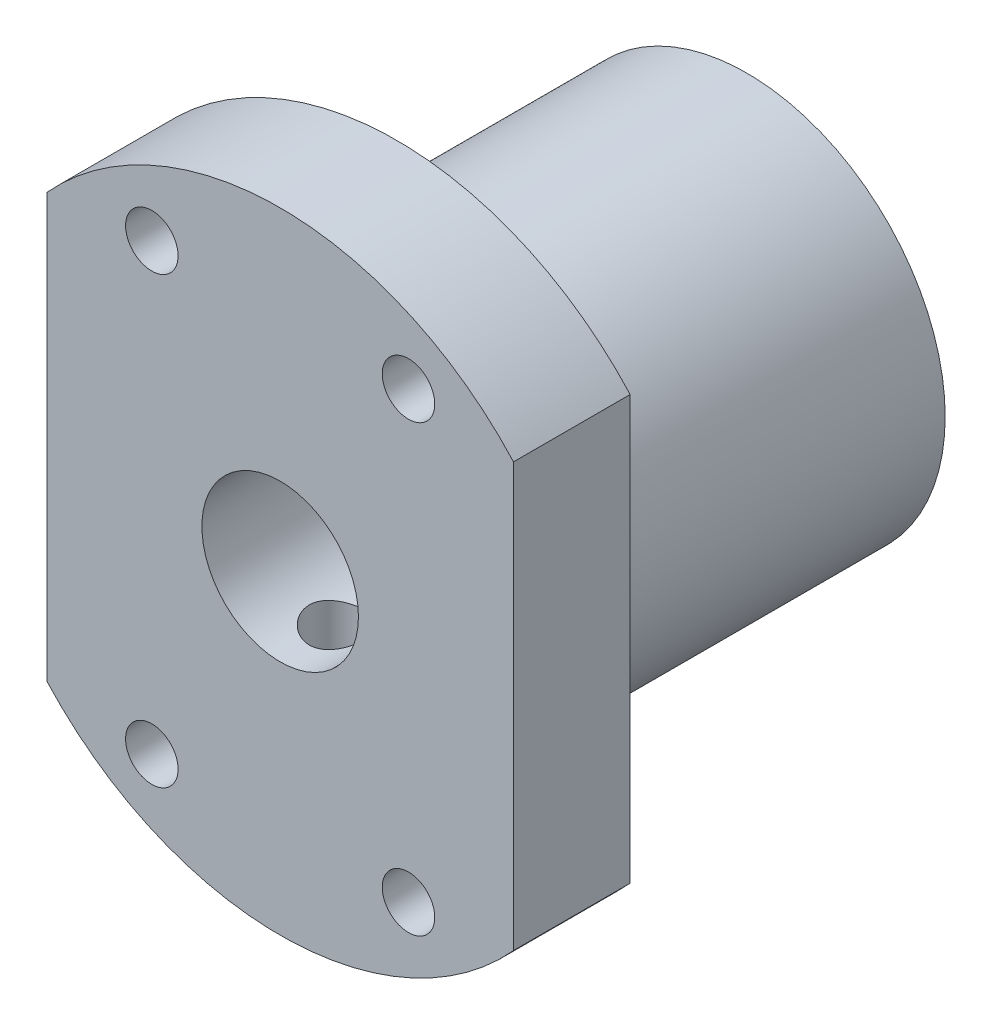
ISO-10303-21;
HEADER;
FILE_DESCRIPTION(('STEP AP214'),'2;1');
FILE_NAME('part.step','',(''),(''),'','','');
FILE_SCHEMA(('AUTOMOTIVE_DESIGN { 1 0 10303 214 1 1 1 1 }'));
ENDSEC;
DATA;
#1=APPLICATION_CONTEXT('core data for automotive mechanical design processes');
#2=APPLICATION_PROTOCOL_DEFINITION('international standard','automotive_design',2000,#1);
#3=PRODUCT_CONTEXT('',#1,'mechanical');
#4=PRODUCT('Part','Part','',(#3));
#5=PRODUCT_RELATED_PRODUCT_CATEGORY('part','',(#4));
#6=PRODUCT_DEFINITION_FORMATION('','',#4);
#7=PRODUCT_DEFINITION_CONTEXT('part definition',#1,'design');
#8=PRODUCT_DEFINITION('design','',#6,#7);
#9=PRODUCT_DEFINITION_SHAPE('','',#8);
#10=(LENGTH_UNIT() NAMED_UNIT(*) SI_UNIT(.MILLI.,.METRE.));
#11=(NAMED_UNIT(*) PLANE_ANGLE_UNIT() SI_UNIT($,.RADIAN.));
#12=(NAMED_UNIT(*) SI_UNIT($,.STERADIAN.) SOLID_ANGLE_UNIT());
#13=UNCERTAINTY_MEASURE_WITH_UNIT(LENGTH_MEASURE(1.E-05),#10,'distance_accuracy_value','');
#14=(GEOMETRIC_REPRESENTATION_CONTEXT(3) GLOBAL_UNCERTAINTY_ASSIGNED_CONTEXT((#13)) GLOBAL_UNIT_ASSIGNED_CONTEXT((#10,
#11,#12)) REPRESENTATION_CONTEXT('',''));
#15=CARTESIAN_POINT('',(0.,0.,0.));
#16=DIRECTION('',(0.,0.,1.));
#17=DIRECTION('',(1.,0.,0.));
#18=AXIS2_PLACEMENT_3D('',#15,#16,#17);
#19=CARTESIAN_POINT('',(0.,0.,30.));
#20=DIRECTION('',(0.,0.,-1.));
#21=DIRECTION('',(-1.,0.,0.));
#22=AXIS2_PLACEMENT_3D('',#19,#20,#21);
#23=CYLINDRICAL_SURFACE('',#22,17.);
#24=CARTESIAN_POINT('',(0.,0.,30.));
#25=DIRECTION('',(0.,0.,1.));
#26=DIRECTION('',(1.,0.,0.));
#27=AXIS2_PLACEMENT_3D('',#24,#25,#26);
#28=CIRCLE('',#27,17.);
#29=CARTESIAN_POINT('',(17.,0.,30.));
#30=VERTEX_POINT('',#29);
#31=EDGE_CURVE('E11',#30,#30,#28,.T.);
#32=ORIENTED_EDGE('',*,*,#31,.F.);
#33=EDGE_LOOP('',(#32));
#34=FACE_BOUND('',#33,.T.);
#35=CARTESIAN_POINT('',(0.,0.,0.));
#36=DIRECTION('',(0.,0.,1.));
#37=DIRECTION('',(1.,0.,0.));
#38=AXIS2_PLACEMENT_3D('',#35,#36,#37);
#39=CIRCLE('',#38,17.);
#40=CARTESIAN_POINT('',(17.,0.,0.));
#41=VERTEX_POINT('',#40);
#42=EDGE_CURVE('E54',#41,#41,#39,.T.);
#43=ORIENTED_EDGE('',*,*,#42,.T.);
#44=EDGE_LOOP('',(#43));
#45=FACE_BOUND('',#44,.T.);
#46=ADVANCED_FACE('F45',(#34,#45),#23,.T.);
#47=CARTESIAN_POINT('',(0.,0.,0.));
#48=DIRECTION('',(0.,0.,1.));
#49=DIRECTION('',(1.,0.,0.));
#50=AXIS2_PLACEMENT_3D('',#47,#48,#49);
#51=PLANE('',#50);
#52=CARTESIAN_POINT('',(0.,0.,0.));
#53=DIRECTION('',(0.,0.,1.));
#54=DIRECTION('',(1.,0.,0.));
#55=AXIS2_PLACEMENT_3D('',#52,#53,#54);
#56=CIRCLE('',#55,6.71);
#57=CARTESIAN_POINT('',(6.71,0.,0.));
#58=VERTEX_POINT('',#57);
#59=EDGE_CURVE('E117',#58,#58,#56,.T.);
#60=ORIENTED_EDGE('',*,*,#59,.T.);
#61=EDGE_LOOP('',(#60));
#62=FACE_BOUND('',#61,.T.);
#63=ORIENTED_EDGE('',*,*,#42,.F.);
#64=EDGE_LOOP('',(#63));
#65=FACE_BOUND('',#64,.T.);
#66=ADVANCED_FACE('F192',(#62,#65),#51,.F.);
#67=CARTESIAN_POINT('',(0.,0.,40.));
#68=DIRECTION('',(0.,0.,-1.));
#69=DIRECTION('',(-1.,0.,0.));
#70=AXIS2_PLACEMENT_3D('',#67,#68,#69);
#71=CYLINDRICAL_SURFACE('',#70,27.);
#72=CARTESIAN_POINT('',(0.,-27.,32.5));
#73=CARTESIAN_POINT('',(-0.140104235423215,-26.9999984961553,32.5000060923694));
#74=CARTESIAN_POINT('',(-0.280302384014452,-26.9988978837974,32.5118171538472));
#75=CARTESIAN_POINT('',(-0.556815501018243,-26.994613150113,32.5587575534022));
#76=CARTESIAN_POINT('',(-0.693125957308726,-26.9914267030359,32.5939129215156));
#77=CARTESIAN_POINT('',(-0.957819202277347,-26.9833301753631,32.6865129349939));
#78=CARTESIAN_POINT('',(-1.08620658706337,-26.9784211053112,32.7439445145226));
#79=CARTESIAN_POINT('',(-1.33148991349305,-26.967429000352,32.8794422251519));
#80=CARTESIAN_POINT('',(-1.44838821401108,-26.9613462071902,32.9575041083617));
#81=CARTESIAN_POINT('',(-1.66776778313693,-26.9486674452795,33.1323076679661));
#82=CARTESIAN_POINT('',(-1.77020835177316,-26.942070105914,33.2291003283338));
#83=CARTESIAN_POINT('',(-1.95741499110691,-26.9291172230945,33.4385095063795));
#84=CARTESIAN_POINT('',(-2.04218026381452,-26.922761690568,33.5511267381083));
#85=CARTESIAN_POINT('',(-2.19177159042703,-26.910997715518,33.7892394981135));
#86=CARTESIAN_POINT('',(-2.2565612653947,-26.9055910085878,33.9147579740917));
#87=CARTESIAN_POINT('',(-2.36412993266883,-26.8963533138604,34.1749507255611));
#88=CARTESIAN_POINT('',(-2.40690939614941,-26.8925222923327,34.3096248049877));
#89=CARTESIAN_POINT('',(-2.4691237282045,-26.8868817664577,34.5838937737516));
#90=CARTESIAN_POINT('',(-2.48862560729415,-26.8850664604117,34.7234733413318));
#91=CARTESIAN_POINT('',(-2.50393826751966,-26.883644757109,35.0039354703639));
#92=CARTESIAN_POINT('',(-2.49974958811319,-26.8840383095543,35.144818002073));
#93=CARTESIAN_POINT('',(-2.46785533178804,-26.8869845689713,35.4234262626904));
#94=CARTESIAN_POINT('',(-2.44022276185891,-26.8895305728732,35.5611604300467));
#95=CARTESIAN_POINT('',(-2.36233862826438,-26.8964843763958,35.8300275853247));
#96=CARTESIAN_POINT('',(-2.31208679841198,-26.9008921979266,35.9611604955416));
#97=CARTESIAN_POINT('',(-2.19030948488409,-26.9110807045729,36.21333433213));
#98=CARTESIAN_POINT('',(-2.11875144061958,-26.9168634881887,36.3343594464337));
#99=CARTESIAN_POINT('',(-1.95641639934847,-26.9291485005591,36.5627092576433));
#100=CARTESIAN_POINT('',(-1.86563892062509,-26.9356507473445,36.6700336110445));
#101=CARTESIAN_POINT('',(-1.66703328800995,-26.9486718987524,36.8683597166194));
#102=CARTESIAN_POINT('',(-1.55914205320935,-26.955190773581,36.9592983129016));
#103=CARTESIAN_POINT('',(-1.32959106587489,-26.9674873959579,37.121782544752));
#104=CARTESIAN_POINT('',(-1.20793130104502,-26.9732651428444,37.193328163001));
#105=CARTESIAN_POINT('',(-0.954254232553548,-26.9834300275726,37.3149923356432));
#106=CARTESIAN_POINT('',(-0.822235474916743,-26.9878169697657,37.3651078757479));
#107=CARTESIAN_POINT('',(-0.551607743612341,-26.9947038570175,37.4424439763866));
#108=CARTESIAN_POINT('',(-0.412998938941702,-26.9972038504381,37.4696651236965));
#109=CARTESIAN_POINT('',(-0.13367286960418,-27.0000289511535,37.5003600473184));
#110=CARTESIAN_POINT('',(0.00703473650901965,-27.0003620435566,37.503921013287));
#111=CARTESIAN_POINT('',(0.287044831518526,-26.998837183911,37.4874232152427));
#112=CARTESIAN_POINT('',(0.42634733662945,-26.9969792571754,37.4673647241095));
#113=CARTESIAN_POINT('',(0.699342711141585,-26.9912863376143,37.4042697012871));
#114=CARTESIAN_POINT('',(0.833045050703778,-26.9874548413047,37.3612738023443));
#115=CARTESIAN_POINT('',(1.09133866999029,-26.9782448882492,37.2535660968901));
#116=CARTESIAN_POINT('',(1.21592977322662,-26.9728664015474,37.1888538698611));
#117=CARTESIAN_POINT('',(1.45285965125482,-26.9611447903146,37.0393328775811));
#118=CARTESIAN_POINT('',(1.56516199660456,-26.9547989243687,36.9544666048094));
#119=CARTESIAN_POINT('',(1.77395822880261,-26.9418640162311,36.7671293055912));
#120=CARTESIAN_POINT('',(1.8704517760956,-26.9352749688197,36.6646579011029));
#121=CARTESIAN_POINT('',(2.04519234449268,-26.9225724754851,36.4446396565999));
#122=CARTESIAN_POINT('',(2.12338229421004,-26.9164605557349,36.3270473895176));
#123=CARTESIAN_POINT('',(2.25890428387433,-26.9054268542182,36.0803504478908));
#124=CARTESIAN_POINT('',(2.31623657350824,-26.9005050582051,35.9512459111829));
#125=CARTESIAN_POINT('',(2.40831946324571,-26.8924179913384,35.6853879217804));
#126=CARTESIAN_POINT('',(2.44310447697423,-26.88925004469,35.5486464733761));
#127=CARTESIAN_POINT('',(2.4892172388725,-26.8850207781397,35.2712330857293));
#128=CARTESIAN_POINT('',(2.50054555558387,-26.8839594071788,35.1305612418354));
#129=CARTESIAN_POINT('',(2.49941608989874,-26.8840643946355,34.8498474179256));
#130=CARTESIAN_POINT('',(2.48704796656483,-26.8852223558798,34.7098050653457));
#131=CARTESIAN_POINT('',(2.43906421479058,-26.8896176606761,34.4337962093497));
#132=CARTESIAN_POINT('',(2.40344855553537,-26.8928550069842,34.2978297113365));
#133=CARTESIAN_POINT('',(2.31000454921188,-26.9010420430752,34.0338298469715));
#134=CARTESIAN_POINT('',(2.25217837216337,-26.9059915655697,33.9057957070284));
#135=CARTESIAN_POINT('',(2.11596435322811,-26.9170455947568,33.6612371475703));
#136=CARTESIAN_POINT('',(2.03757672296597,-26.9231500895619,33.544712609612));
#137=CARTESIAN_POINT('',(1.86212786096722,-26.9358538383057,33.3260215946643));
#138=CARTESIAN_POINT('',(1.76499995923221,-26.9424548057348,33.2239087037833));
#139=CARTESIAN_POINT('',(1.5549555123835,-26.9553920497328,33.0373888921365));
#140=CARTESIAN_POINT('',(1.44203517356209,-26.961728262225,32.9529862379954));
#141=CARTESIAN_POINT('',(1.20334437408051,-26.9734362139615,32.8041412469635));
#142=CARTESIAN_POINT('',(1.07754609194711,-26.9788057928449,32.7397433921616));
#143=CARTESIAN_POINT('',(0.816955148829271,-26.9879512452879,32.6330690038244));
#144=CARTESIAN_POINT('',(0.682172919565208,-26.9917289311879,32.5907673010105));
#145=CARTESIAN_POINT('',(0.455510371441178,-26.9963061127391,32.5401394944644));
#146=CARTESIAN_POINT('',(0.365083216041561,-26.9976849328793,32.5251074879196));
#147=CARTESIAN_POINT('',(0.183117412852132,-26.9995323664483,32.5050357666117));
#148=CARTESIAN_POINT('',(0.0915787688576211,-27.0000009829842,32.4999960177386));
#149=CARTESIAN_POINT('',(0.,-27.,32.5));
#150=B_SPLINE_CURVE_WITH_KNOTS('',3,(#72,#73,#74,#75,#76,#77,#78,#79,#80,#81,#82,#83,#84,#85,
#86,#87,#88,#89,#90,#91,#92,#93,#94,#95,#96,#97,#98,#99,#100,#101,#102,#103,#104,#105,#106,#107,
#108,#109,#110,#111,#112,#113,#114,#115,#116,#117,#118,#119,#120,#121,#122,#123,#124,#125,#126,
#127,#128,#129,#130,#131,#132,#133,#134,#135,#136,#137,#138,#139,#140,#141,#142,#143,#144,#145,
#146,#147,#148,#149),.UNSPECIFIED.,.T.,.F.,(4,2,2,2,2,2,2,2,2,2,2,2,2,2,2,2,2,2,2,2,2,2,2,2,2,2,
2,2,2,2,2,2,2,2,2,2,2,2,4),(0.,0.419978317858611,0.840425720085072,1.26062688610405,
1.68074159775453,2.10201634141781,2.52331010033547,2.94536663508853,3.36741413447187,
3.78824370848131,4.20906369981975,4.62857799888088,5.04809723498126,5.46826090855992,
5.88843511438696,6.3101956895525,6.73195664137524,7.15377689729231,7.57558634176454,
7.99584051850996,8.41608984003527,8.8355971659168,9.25511261565796,9.67583980582887,
10.0965760315652,10.5186071581501,10.9406332324354,11.3620136473385,11.7833838487355,
12.203162880274,12.6229424682355,13.0426810531732,13.4624153182056,13.8836713113363,
14.3050286742517,14.7273163574046,15.1491219664567,15.4236406380256,15.6981583724839),.UNSPECIFIED.);
#151=CARTESIAN_POINT('',(0.,-27.,32.5));
#152=VERTEX_POINT('',#151);
#153=EDGE_CURVE('E158',#152,#152,#150,.T.);
#154=ORIENTED_EDGE('',*,*,#153,.T.);
#155=EDGE_LOOP('',(#154));
#156=FACE_BOUND('',#155,.T.);
#157=CARTESIAN_POINT('',(0.,0.,30.));
#158=DIRECTION('',(0.,0.,1.));
#159=DIRECTION('',(1.,0.,0.));
#160=AXIS2_PLACEMENT_3D('',#157,#158,#159);
#161=CIRCLE('',#160,27.);
#162=CARTESIAN_POINT('',(-20.,-18.1383571472171,30.));
#163=VERTEX_POINT('',#162);
#164=CARTESIAN_POINT('',(20.,-18.1383571472171,30.));
#165=VERTEX_POINT('',#164);
#166=EDGE_CURVE('E114',#163,#165,#161,.T.);
#167=ORIENTED_EDGE('',*,*,#166,.T.);
#168=DIRECTION('',(0.,0.,-1.));
#169=VECTOR('',#168,1.);
#170=CARTESIAN_POINT('',(20.,-18.1383571472171,40.));
#171=LINE('',#170,#169);
#172=CARTESIAN_POINT('',(20.,-18.1383571472171,40.));
#173=VERTEX_POINT('',#172);
#174=EDGE_CURVE('E105',#173,#165,#171,.T.);
#175=ORIENTED_EDGE('',*,*,#174,.F.);
#176=CARTESIAN_POINT('',(0.,0.,40.));
#177=DIRECTION('',(0.,0.,1.));
#178=DIRECTION('',(1.,0.,0.));
#179=AXIS2_PLACEMENT_3D('',#176,#177,#178);
#180=CIRCLE('',#179,27.);
#181=CARTESIAN_POINT('',(-20.,-18.1383571472171,40.));
#182=VERTEX_POINT('',#181);
#183=EDGE_CURVE('E99',#182,#173,#180,.T.);
#184=ORIENTED_EDGE('',*,*,#183,.F.);
#185=DIRECTION('',(0.,0.,-1.));
#186=VECTOR('',#185,1.);
#187=CARTESIAN_POINT('',(-20.,-18.1383571472171,40.));
#188=LINE('',#187,#186);
#189=EDGE_CURVE('E110',#182,#163,#188,.T.);
#190=ORIENTED_EDGE('',*,*,#189,.T.);
#191=EDGE_LOOP('',(#167,#175,#184,#190));
#192=FACE_BOUND('',#191,.T.);
#193=ADVANCED_FACE('F197',(#156,#192),#71,.T.);
#194=CARTESIAN_POINT('',(20.,-18.1383571472171,40.));
#195=DIRECTION('',(-1.,0.,0.));
#196=DIRECTION('',(0.,0.,1.));
#197=AXIS2_PLACEMENT_3D('',#194,#195,#196);
#198=PLANE('',#197);
#199=DIRECTION('',(0.,1.,0.));
#200=VECTOR('',#199,1.);
#201=CARTESIAN_POINT('',(20.,-18.1383571472171,30.));
#202=LINE('',#201,#200);
#203=CARTESIAN_POINT('',(20.,18.1383571472171,30.));
#204=VERTEX_POINT('',#203);
#205=EDGE_CURVE('E104',#165,#204,#202,.T.);
#206=ORIENTED_EDGE('',*,*,#205,.T.);
#207=DIRECTION('',(0.,0.,-1.));
#208=VECTOR('',#207,1.);
#209=CARTESIAN_POINT('',(20.,18.1383571472171,40.));
#210=LINE('',#209,#208);
#211=CARTESIAN_POINT('',(20.,18.1383571472171,40.));
#212=VERTEX_POINT('',#211);
#213=EDGE_CURVE('E102',#212,#204,#210,.T.);
#214=ORIENTED_EDGE('',*,*,#213,.F.);
#215=DIRECTION('',(0.,1.,0.));
#216=VECTOR('',#215,1.);
#217=CARTESIAN_POINT('',(20.,-18.1383571472171,40.));
#218=LINE('',#217,#216);
#219=EDGE_CURVE('E94',#173,#212,#218,.T.);
#220=ORIENTED_EDGE('',*,*,#219,.F.);
#221=ORIENTED_EDGE('',*,*,#174,.T.);
#222=EDGE_LOOP('',(#206,#214,#220,#221));
#223=FACE_BOUND('',#222,.T.);
#224=ADVANCED_FACE('F103',(#223),#198,.F.);
#225=CARTESIAN_POINT('',(0.,0.,40.));
#226=DIRECTION('',(0.,0.,-1.));
#227=DIRECTION('',(-1.,0.,0.));
#228=AXIS2_PLACEMENT_3D('',#225,#226,#227);
#229=CYLINDRICAL_SURFACE('',#228,27.);
#230=CARTESIAN_POINT('',(0.,0.,30.));
#231=DIRECTION('',(0.,0.,1.));
#232=DIRECTION('',(1.,0.,0.));
#233=AXIS2_PLACEMENT_3D('',#230,#231,#232);
#234=CIRCLE('',#233,27.);
#235=CARTESIAN_POINT('',(-20.,18.1383571472171,30.));
#236=VERTEX_POINT('',#235);
#237=EDGE_CURVE('E80',#204,#236,#234,.T.);
#238=ORIENTED_EDGE('',*,*,#237,.T.);
#239=DIRECTION('',(0.,0.,-1.));
#240=VECTOR('',#239,1.);
#241=CARTESIAN_POINT('',(-20.,18.1383571472171,40.));
#242=LINE('',#241,#240);
#243=CARTESIAN_POINT('',(-20.,18.1383571472171,40.));
#244=VERTEX_POINT('',#243);
#245=EDGE_CURVE('E106',#244,#236,#242,.T.);
#246=ORIENTED_EDGE('',*,*,#245,.F.);
#247=CARTESIAN_POINT('',(0.,0.,40.));
#248=DIRECTION('',(0.,0.,1.));
#249=DIRECTION('',(1.,0.,0.));
#250=AXIS2_PLACEMENT_3D('',#247,#248,#249);
#251=CIRCLE('',#250,27.);
#252=EDGE_CURVE('E97',#212,#244,#251,.T.);
#253=ORIENTED_EDGE('',*,*,#252,.F.);
#254=ORIENTED_EDGE('',*,*,#213,.T.);
#255=EDGE_LOOP('',(#238,#246,#253,#254));
#256=FACE_BOUND('',#255,.T.);
#257=ADVANCED_FACE('F108',(#256),#229,.T.);
#258=CARTESIAN_POINT('',(-20.,-18.1383571472171,40.));
#259=DIRECTION('',(1.,0.,0.));
#260=DIRECTION('',(0.,0.,-1.));
#261=AXIS2_PLACEMENT_3D('',#258,#259,#260);
#262=PLANE('',#261);
#263=DIRECTION('',(0.,-1.,0.));
#264=VECTOR('',#263,1.);
#265=CARTESIAN_POINT('',(-20.,-18.1383571472171,30.));
#266=LINE('',#265,#264);
#267=EDGE_CURVE('E86',#236,#163,#266,.T.);
#268=ORIENTED_EDGE('',*,*,#267,.T.);
#269=ORIENTED_EDGE('',*,*,#189,.F.);
#270=DIRECTION('',(0.,-1.,0.));
#271=VECTOR('',#270,1.);
#272=CARTESIAN_POINT('',(-20.,-18.1383571472171,40.));
#273=LINE('',#272,#271);
#274=EDGE_CURVE('E63',#244,#182,#273,.T.);
#275=ORIENTED_EDGE('',*,*,#274,.F.);
#276=ORIENTED_EDGE('',*,*,#245,.T.);
#277=EDGE_LOOP('',(#268,#269,#275,#276));
#278=FACE_BOUND('',#277,.T.);
#279=ADVANCED_FACE('F211',(#278),#262,.F.);
#280=CARTESIAN_POINT('',(0.,0.,40.));
#281=DIRECTION('',(0.,0.,1.));
#282=DIRECTION('',(1.,0.,0.));
#283=AXIS2_PLACEMENT_3D('',#280,#281,#282);
#284=PLANE('',#283);
#285=CARTESIAN_POINT('',(-10.9999999999999,19.0525588832577,40.));
#286=DIRECTION('',(0.,0.,1.));
#287=DIRECTION('',(1.,0.,0.));
#288=AXIS2_PLACEMENT_3D('',#285,#286,#287);
#289=CIRCLE('',#288,2.24999999999999);
#290=CARTESIAN_POINT('',(-8.7499999999999,19.0525588832577,40.));
#291=VERTEX_POINT('',#290);
#292=EDGE_CURVE('E146',#291,#291,#289,.T.);
#293=ORIENTED_EDGE('',*,*,#292,.F.);
#294=EDGE_LOOP('',(#293));
#295=FACE_BOUND('',#294,.T.);
#296=CARTESIAN_POINT('',(11.0000000000002,19.0525588832576,40.));
#297=DIRECTION('',(0.,0.,1.));
#298=DIRECTION('',(1.,0.,0.));
#299=AXIS2_PLACEMENT_3D('',#296,#297,#298);
#300=CIRCLE('',#299,2.24999999999999);
#301=CARTESIAN_POINT('',(13.2500000000001,19.0525588832576,40.));
#302=VERTEX_POINT('',#301);
#303=EDGE_CURVE('E136',#302,#302,#300,.T.);
#304=ORIENTED_EDGE('',*,*,#303,.F.);
#305=EDGE_LOOP('',(#304));
#306=FACE_BOUND('',#305,.T.);
#307=CARTESIAN_POINT('',(10.9999999999998,-19.0525588832578,40.));
#308=DIRECTION('',(0.,0.,1.));
#309=DIRECTION('',(1.,0.,0.));
#310=AXIS2_PLACEMENT_3D('',#307,#308,#309);
#311=CIRCLE('',#310,2.24999999999999);
#312=CARTESIAN_POINT('',(13.2499999999997,-19.0525588832578,40.));
#313=VERTEX_POINT('',#312);
#314=EDGE_CURVE('E133',#313,#313,#311,.T.);
#315=ORIENTED_EDGE('',*,*,#314,.F.);
#316=EDGE_LOOP('',(#315));
#317=FACE_BOUND('',#316,.T.);
#318=CARTESIAN_POINT('',(-11.0000000000003,-19.0525588832575,40.));
#319=DIRECTION('',(0.,0.,1.));
#320=DIRECTION('',(1.,0.,0.));
#321=AXIS2_PLACEMENT_3D('',#318,#319,#320);
#322=CIRCLE('',#321,2.24999999999999);
#323=CARTESIAN_POINT('',(-8.75000000000029,-19.0525588832575,40.));
#324=VERTEX_POINT('',#323);
#325=EDGE_CURVE('E130',#324,#324,#322,.T.);
#326=ORIENTED_EDGE('',*,*,#325,.F.);
#327=EDGE_LOOP('',(#326));
#328=FACE_BOUND('',#327,.T.);
#329=CARTESIAN_POINT('',(0.,0.,40.));
#330=DIRECTION('',(0.,0.,1.));
#331=DIRECTION('',(1.,0.,0.));
#332=AXIS2_PLACEMENT_3D('',#329,#330,#331);
#333=CIRCLE('',#332,6.71);
#334=CARTESIAN_POINT('',(6.71,0.,40.));
#335=VERTEX_POINT('',#334);
#336=EDGE_CURVE('E231',#335,#335,#333,.T.);
#337=ORIENTED_EDGE('',*,*,#336,.F.);
#338=EDGE_LOOP('',(#337));
#339=FACE_BOUND('',#338,.T.);
#340=ORIENTED_EDGE('',*,*,#183,.T.);
#341=ORIENTED_EDGE('',*,*,#219,.T.);
#342=ORIENTED_EDGE('',*,*,#252,.T.);
#343=ORIENTED_EDGE('',*,*,#274,.T.);
#344=EDGE_LOOP('',(#340,#341,#342,#343));
#345=FACE_BOUND('',#344,.T.);
#346=ADVANCED_FACE('F95',(#295,#306,#317,#328,#339,#345),#284,.T.);
#347=CARTESIAN_POINT('',(0.,0.,30.));
#348=DIRECTION('',(0.,0.,1.));
#349=DIRECTION('',(1.,0.,0.));
#350=AXIS2_PLACEMENT_3D('',#347,#348,#349);
#351=PLANE('',#350);
#352=CARTESIAN_POINT('',(-10.9999999999999,19.0525588832577,30.));
#353=DIRECTION('',(0.,0.,1.));
#354=DIRECTION('',(1.,0.,0.));
#355=AXIS2_PLACEMENT_3D('',#352,#353,#354);
#356=CIRCLE('',#355,2.24999999999999);
#357=CARTESIAN_POINT('',(-8.7499999999999,19.0525588832577,30.));
#358=VERTEX_POINT('',#357);
#359=EDGE_CURVE('E48',#358,#358,#356,.T.);
#360=ORIENTED_EDGE('',*,*,#359,.T.);
#361=EDGE_LOOP('',(#360));
#362=FACE_BOUND('',#361,.T.);
#363=CARTESIAN_POINT('',(11.0000000000002,19.0525588832576,30.));
#364=DIRECTION('',(0.,0.,1.));
#365=DIRECTION('',(1.,0.,0.));
#366=AXIS2_PLACEMENT_3D('',#363,#364,#365);
#367=CIRCLE('',#366,2.24999999999999);
#368=CARTESIAN_POINT('',(13.2500000000001,19.0525588832576,30.));
#369=VERTEX_POINT('',#368);
#370=EDGE_CURVE('E134',#369,#369,#367,.T.);
#371=ORIENTED_EDGE('',*,*,#370,.T.);
#372=EDGE_LOOP('',(#371));
#373=FACE_BOUND('',#372,.T.);
#374=CARTESIAN_POINT('',(10.9999999999998,-19.0525588832578,30.));
#375=DIRECTION('',(0.,0.,1.));
#376=DIRECTION('',(1.,0.,0.));
#377=AXIS2_PLACEMENT_3D('',#374,#375,#376);
#378=CIRCLE('',#377,2.24999999999999);
#379=CARTESIAN_POINT('',(13.2499999999998,-19.0525588832578,30.));
#380=VERTEX_POINT('',#379);
#381=EDGE_CURVE('E131',#380,#380,#378,.T.);
#382=ORIENTED_EDGE('',*,*,#381,.T.);
#383=EDGE_LOOP('',(#382));
#384=FACE_BOUND('',#383,.T.);
#385=CARTESIAN_POINT('',(-11.0000000000003,-19.0525588832575,30.));
#386=DIRECTION('',(0.,0.,1.));
#387=DIRECTION('',(1.,0.,0.));
#388=AXIS2_PLACEMENT_3D('',#385,#386,#387);
#389=CIRCLE('',#388,2.24999999999999);
#390=CARTESIAN_POINT('',(-8.75000000000029,-19.0525588832575,30.));
#391=VERTEX_POINT('',#390);
#392=EDGE_CURVE('E126',#391,#391,#389,.T.);
#393=ORIENTED_EDGE('',*,*,#392,.T.);
#394=EDGE_LOOP('',(#393));
#395=FACE_BOUND('',#394,.T.);
#396=ORIENTED_EDGE('',*,*,#31,.T.);
#397=EDGE_LOOP('',(#396));
#398=FACE_BOUND('',#397,.T.);
#399=ORIENTED_EDGE('',*,*,#166,.F.);
#400=ORIENTED_EDGE('',*,*,#267,.F.);
#401=ORIENTED_EDGE('',*,*,#237,.F.);
#402=ORIENTED_EDGE('',*,*,#205,.F.);
#403=EDGE_LOOP('',(#399,#400,#401,#402));
#404=FACE_BOUND('',#403,.T.);
#405=ADVANCED_FACE('F204',(#362,#373,#384,#395,#398,#404),#351,.F.);
#406=CARTESIAN_POINT('',(0.,0.,0.));
#407=DIRECTION('',(0.,0.,1.));
#408=DIRECTION('',(1.,0.,0.));
#409=AXIS2_PLACEMENT_3D('',#406,#407,#408);
#410=CYLINDRICAL_SURFACE('',#409,6.71);
#411=CARTESIAN_POINT('',(0.,-6.71,32.5));
#412=CARTESIAN_POINT('',(0.13545358421326,-6.71000338788873,32.4999954565781));
#413=CARTESIAN_POINT('',(0.270875851713934,-6.70586260972186,32.5110431125202));
#414=CARTESIAN_POINT('',(0.537676625190061,-6.68975767805625,32.5547656778076));
#415=CARTESIAN_POINT('',(0.669055653682061,-6.67779453994114,32.5874377801923));
#416=CARTESIAN_POINT('',(0.923883913029479,-6.647329981472,32.6730956295985));
#417=CARTESIAN_POINT('',(1.04734779408625,-6.62884107831866,32.7260425035693));
#418=CARTESIAN_POINT('',(1.28363289815691,-6.58716925100678,32.8505505494777));
#419=CARTESIAN_POINT('',(1.39645129519047,-6.5639850855409,32.9221166452888));
#420=CARTESIAN_POINT('',(1.61298212034457,-6.51423070564051,33.0849726466301));
#421=CARTESIAN_POINT('',(1.71618797482786,-6.48756551693428,33.1769068034203));
#422=CARTESIAN_POINT('',(1.90612394853089,-6.43432507006212,33.3765215181497));
#423=CARTESIAN_POINT('',(1.99284911863016,-6.40774984125671,33.4842067889944));
#424=CARTESIAN_POINT('',(2.15056269170044,-6.35659695368701,33.7171927252063));
#425=CARTESIAN_POINT('',(2.22083900253137,-6.3321315763097,33.8430025380732));
#426=CARTESIAN_POINT('',(2.33901015625126,-6.28944422265473,34.1057111179156));
#427=CARTESIAN_POINT('',(2.3869138076926,-6.2712197899506,34.24260549573));
#428=CARTESIAN_POINT('',(2.4569859760844,-6.24409227393766,34.5177696428881));
#429=CARTESIAN_POINT('',(2.48012028836095,-6.23484081609842,34.6557579708187));
#430=CARTESIAN_POINT('',(2.50301686316067,-6.22568662525058,34.9339444016417));
#431=CARTESIAN_POINT('',(2.50278861920606,-6.22578009487134,35.0741415837964));
#432=CARTESIAN_POINT('',(2.47970576597698,-6.23500451843236,35.3439675987711));
#433=CARTESIAN_POINT('',(2.45818587996304,-6.24360234557379,35.4737322083492));
#434=CARTESIAN_POINT('',(2.39533535072887,-6.26798155517415,35.7276551834412));
#435=CARTESIAN_POINT('',(2.3540017632421,-6.28376400523254,35.8518127127558));
#436=CARTESIAN_POINT('',(2.25195586783968,-6.32105866897141,36.0937361863003));
#437=CARTESIAN_POINT('',(2.19089446249203,-6.34267284724779,36.2113384670272));
#438=CARTESIAN_POINT('',(2.05136951191816,-6.38916112765023,36.4350168341245));
#439=CARTESIAN_POINT('',(1.9729000132464,-6.41403634383493,36.5410889587269));
#440=CARTESIAN_POINT('',(1.79466180451728,-6.46625523554799,36.7460911621229));
#441=CARTESIAN_POINT('',(1.69382616569495,-6.49365324760718,36.84408201064));
#442=CARTESIAN_POINT('',(1.47683633513956,-6.54641190950719,37.0220399877301));
#443=CARTESIAN_POINT('',(1.36067985344075,-6.57177225386959,37.102004417092));
#444=CARTESIAN_POINT('',(1.1139746758237,-6.61809081588035,37.2426577263103));
#445=CARTESIAN_POINT('',(0.983235264004655,-6.63897683677537,37.3030375551565));
#446=CARTESIAN_POINT('',(0.712482949693827,-6.67345869469701,37.4006354520728));
#447=CARTESIAN_POINT('',(0.572474140601573,-6.6870577258746,37.4378636694819));
#448=CARTESIAN_POINT('',(0.295064914725612,-6.70487385572658,37.4863046158402));
#449=CARTESIAN_POINT('',(0.157914453992396,-6.70954667884209,37.4987823689685));
#450=CARTESIAN_POINT('',(-0.116584118958238,-6.71038967754691,37.5010468088732));
#451=CARTESIAN_POINT('',(-0.253932181478958,-6.7065617094867,37.490838449703));
#452=CARTESIAN_POINT('',(-0.519485222219613,-6.69113398172984,37.4489845617682));
#453=CARTESIAN_POINT('',(-0.647839525933752,-6.67983369003903,37.4181645632616));
#454=CARTESIAN_POINT('',(-0.897467478217629,-6.65089870800001,37.3370458700286));
#455=CARTESIAN_POINT('',(-1.01874020320904,-6.63326319354864,37.2867446410637));
#456=CARTESIAN_POINT('',(-1.25473469510208,-6.59276132039497,37.1664931346525));
#457=CARTESIAN_POINT('',(-1.36916125579461,-6.56975709878623,37.0960113612966));
#458=CARTESIAN_POINT('',(-1.5849442275018,-6.52106643561011,36.9380016286582));
#459=CARTESIAN_POINT('',(-1.68629583502291,-6.49537901452183,36.8504674341114));
#460=CARTESIAN_POINT('',(-1.87912021647011,-6.44232712944689,36.6549378533993));
#461=CARTESIAN_POINT('',(-1.96969507444935,-6.4149508566807,36.5460578819182));
#462=CARTESIAN_POINT('',(-2.13146151215079,-6.36303469099628,36.314102017804));
#463=CARTESIAN_POINT('',(-2.20265147032403,-6.33849503546013,36.1910249388065));
#464=CARTESIAN_POINT('',(-2.32366910894644,-6.29514348400282,35.9332213283889));
#465=CARTESIAN_POINT('',(-2.37341700903591,-6.27635305339045,35.7984534940605));
#466=CARTESIAN_POINT('',(-2.4491927412964,-6.2471782040478,35.5215598501371));
#467=CARTESIAN_POINT('',(-2.47523499097924,-6.23678867641228,35.3794385684928));
#468=CARTESIAN_POINT('',(-2.5015808769254,-6.22626494313782,35.1015877374769));
#469=CARTESIAN_POINT('',(-2.50341311830935,-6.22552173162567,34.9660249723225));
#470=CARTESIAN_POINT('',(-2.48519386372943,-6.2328168566084,34.6966319091824));
#471=CARTESIAN_POINT('',(-2.46514438793026,-6.2408543824478,34.5628014524205));
#472=CARTESIAN_POINT('',(-2.40491499680077,-6.26430151336598,34.3047071721716));
#473=CARTESIAN_POINT('',(-2.36535138925803,-6.27948480238439,34.180277213597));
#474=CARTESIAN_POINT('',(-2.26775669431904,-6.31538357671163,33.9397468580661));
#475=CARTESIAN_POINT('',(-2.20972096721504,-6.33610045170042,33.8236485627908));
#476=CARTESIAN_POINT('',(-2.07333091253619,-6.3820707313233,33.596523610611));
#477=CARTESIAN_POINT('',(-1.99407796247429,-6.40750384755165,33.4860733898189));
#478=CARTESIAN_POINT('',(-1.8189018505009,-6.45941439034239,33.2795510981594));
#479=CARTESIAN_POINT('',(-1.72297342533239,-6.48589214457655,33.1834835847582));
#480=CARTESIAN_POINT('',(-1.51107459134179,-6.53859874212863,33.0032521935944));
#481=CARTESIAN_POINT('',(-1.39431005114876,-6.56473959235505,32.9199921309662));
#482=CARTESIAN_POINT('',(-1.1475304818375,-6.61234076344258,32.7743085408568));
#483=CARTESIAN_POINT('',(-1.01751471115378,-6.63380082214593,32.7118861803321));
#484=CARTESIAN_POINT('',(-0.742643400595989,-6.67026875175722,32.6081702427229));
#485=CARTESIAN_POINT('',(-0.597412300144889,-6.68500143864571,32.5677665365611));
#486=CARTESIAN_POINT('',(-0.30143940641127,-6.70486284968881,32.5136904236395));
#487=CARTESIAN_POINT('',(-0.150700321431622,-6.70999623076847,32.5000050548322));
#488=CARTESIAN_POINT('',(0.,-6.71,32.5));
#489=B_SPLINE_CURVE_WITH_KNOTS('',3,(#411,#412,#413,#414,#415,#416,#417,#418,#419,#420,#421,
#422,#423,#424,#425,#426,#427,#428,#429,#430,#431,#432,#433,#434,#435,#436,#437,#438,#439,#440,
#441,#442,#443,#444,#445,#446,#447,#448,#449,#450,#451,#452,#453,#454,#455,#456,#457,#458,#459,
#460,#461,#462,#463,#464,#465,#466,#467,#468,#469,#470,#471,#472,#473,#474,#475,#476,#477,#478,
#479,#480,#481,#482,#483,#484,#485,#486,#487,#488),.UNSPECIFIED.,.T.,.F.,(4,2,2,2,2,2,2,2,2,2,2,
2,2,2,2,2,2,2,2,2,2,2,2,2,2,2,2,2,2,2,2,2,2,2,2,2,2,2,4),(0.,0.405804971026804,
0.811557276879463,1.21653549319259,1.62162091548926,2.04204539808963,2.46259593459944,
2.89891723161514,3.33506659530313,3.75351006516079,4.17178349854806,4.56539775853726,
4.95907052676186,5.360130792857,5.76132843076844,6.18911511241921,6.61696580682171,
7.05127226358832,7.48538819208442,7.89667726349325,8.30787652895645,8.70352099900803,
9.09921695422717,9.5064822102599,9.91389666441375,10.3446387533688,10.775416862885,
11.2077842331578,11.6398884663888,12.0445692592512,12.4492126943185,12.8418240185373,
13.2345340342571,13.6476370401852,14.0608706707736,14.496063064956,14.931279826766,
15.3829816419936,15.8344642655616),.UNSPECIFIED.);
#490=CARTESIAN_POINT('',(0.,-6.71,32.5));
#491=VERTEX_POINT('',#490);
#492=EDGE_CURVE('E129',#491,#491,#489,.T.);
#493=ORIENTED_EDGE('',*,*,#492,.T.);
#494=EDGE_LOOP('',(#493));
#495=FACE_BOUND('',#494,.T.);
#496=ORIENTED_EDGE('',*,*,#59,.F.);
#497=EDGE_LOOP('',(#496));
#498=FACE_BOUND('',#497,.T.);
#499=ORIENTED_EDGE('',*,*,#336,.T.);
#500=EDGE_LOOP('',(#499));
#501=FACE_BOUND('',#500,.T.);
#502=ADVANCED_FACE('F171',(#495,#498,#501),#410,.F.);
#503=CARTESIAN_POINT('',(0.,-27.,35.));
#504=DIRECTION('',(0.,-1.,0.));
#505=DIRECTION('',(0.,0.,-1.));
#506=AXIS2_PLACEMENT_3D('',#503,#504,#505);
#507=CYLINDRICAL_SURFACE('',#506,2.5);
#508=ORIENTED_EDGE('',*,*,#492,.F.);
#509=EDGE_LOOP('',(#508));
#510=FACE_BOUND('',#509,.T.);
#511=ORIENTED_EDGE('',*,*,#153,.F.);
#512=EDGE_LOOP('',(#511));
#513=FACE_BOUND('',#512,.T.);
#514=ADVANCED_FACE('F166',(#510,#513),#507,.F.);
#515=CARTESIAN_POINT('',(-11.0000000000003,-19.0525588832575,40.));
#516=DIRECTION('',(0.,0.,1.));
#517=DIRECTION('',(1.,0.,0.));
#518=AXIS2_PLACEMENT_3D('',#515,#516,#517);
#519=CYLINDRICAL_SURFACE('',#518,2.24999999999999);
#520=ORIENTED_EDGE('',*,*,#325,.T.);
#521=EDGE_LOOP('',(#520));
#522=FACE_BOUND('',#521,.T.);
#523=ORIENTED_EDGE('',*,*,#392,.F.);
#524=EDGE_LOOP('',(#523));
#525=FACE_BOUND('',#524,.T.);
#526=ADVANCED_FACE('F170',(#522,#525),#519,.F.);
#527=CARTESIAN_POINT('',(10.9999999999998,-19.0525588832578,40.));
#528=DIRECTION('',(0.,0.,1.));
#529=DIRECTION('',(1.,0.,0.));
#530=AXIS2_PLACEMENT_3D('',#527,#528,#529);
#531=CYLINDRICAL_SURFACE('',#530,2.24999999999999);
#532=ORIENTED_EDGE('',*,*,#314,.T.);
#533=EDGE_LOOP('',(#532));
#534=FACE_BOUND('',#533,.T.);
#535=ORIENTED_EDGE('',*,*,#381,.F.);
#536=EDGE_LOOP('',(#535));
#537=FACE_BOUND('',#536,.T.);
#538=ADVANCED_FACE('F176',(#534,#537),#531,.F.);
#539=CARTESIAN_POINT('',(11.0000000000002,19.0525588832576,40.));
#540=DIRECTION('',(0.,0.,1.));
#541=DIRECTION('',(1.,0.,0.));
#542=AXIS2_PLACEMENT_3D('',#539,#540,#541);
#543=CYLINDRICAL_SURFACE('',#542,2.24999999999999);
#544=ORIENTED_EDGE('',*,*,#303,.T.);
#545=EDGE_LOOP('',(#544));
#546=FACE_BOUND('',#545,.T.);
#547=ORIENTED_EDGE('',*,*,#370,.F.);
#548=EDGE_LOOP('',(#547));
#549=FACE_BOUND('',#548,.T.);
#550=ADVANCED_FACE('F180',(#546,#549),#543,.F.);
#551=CARTESIAN_POINT('',(-10.9999999999999,19.0525588832577,40.));
#552=DIRECTION('',(0.,0.,1.));
#553=DIRECTION('',(1.,0.,0.));
#554=AXIS2_PLACEMENT_3D('',#551,#552,#553);
#555=CYLINDRICAL_SURFACE('',#554,2.24999999999999);
#556=ORIENTED_EDGE('',*,*,#292,.T.);
#557=EDGE_LOOP('',(#556));
#558=FACE_BOUND('',#557,.T.);
#559=ORIENTED_EDGE('',*,*,#359,.F.);
#560=EDGE_LOOP('',(#559));
#561=FACE_BOUND('',#560,.T.);
#562=ADVANCED_FACE('F184',(#558,#561),#555,.F.);
#563=CLOSED_SHELL('',(#46,#66,#193,#224,#257,#279,#346,#405,#502,#514,#526,#538,#550,#562));
#564=MANIFOLD_SOLID_BREP('B2',#563);
#565=ADVANCED_BREP_SHAPE_REPRESENTATION('',(#18,#564),#14);
#566=SHAPE_DEFINITION_REPRESENTATION(#9,#565);
ENDSEC;
END-ISO-10303-21;
